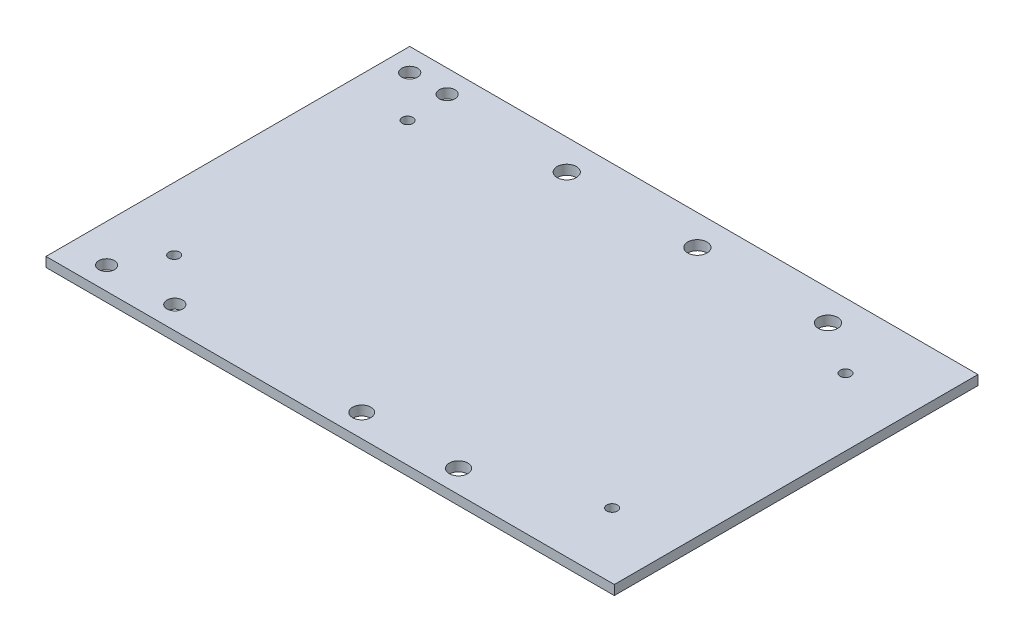
ISO-10303-21;
HEADER;
FILE_DESCRIPTION(('STEP AP214'),'2;1');
FILE_NAME('part.step','',(''),(''),'','','');
FILE_SCHEMA(('AUTOMOTIVE_DESIGN { 1 0 10303 214 1 1 1 1 }'));
ENDSEC;
DATA;
#1=APPLICATION_CONTEXT('core data for automotive mechanical design processes');
#2=APPLICATION_PROTOCOL_DEFINITION('international standard','automotive_design',2000,#1);
#3=PRODUCT_CONTEXT('',#1,'mechanical');
#4=PRODUCT('Part','Part','',(#3));
#5=PRODUCT_RELATED_PRODUCT_CATEGORY('part','',(#4));
#6=PRODUCT_DEFINITION_FORMATION('','',#4);
#7=PRODUCT_DEFINITION_CONTEXT('part definition',#1,'design');
#8=PRODUCT_DEFINITION('design','',#6,#7);
#9=PRODUCT_DEFINITION_SHAPE('','',#8);
#10=(LENGTH_UNIT() NAMED_UNIT(*) SI_UNIT(.MILLI.,.METRE.));
#11=(NAMED_UNIT(*) PLANE_ANGLE_UNIT() SI_UNIT($,.RADIAN.));
#12=(NAMED_UNIT(*) SI_UNIT($,.STERADIAN.) SOLID_ANGLE_UNIT());
#13=UNCERTAINTY_MEASURE_WITH_UNIT(LENGTH_MEASURE(1.E-05),#10,'distance_accuracy_value','');
#14=(GEOMETRIC_REPRESENTATION_CONTEXT(3) GLOBAL_UNCERTAINTY_ASSIGNED_CONTEXT((#13)) GLOBAL_UNIT_ASSIGNED_CONTEXT((#10,
#11,#12)) REPRESENTATION_CONTEXT('',''));
#15=CARTESIAN_POINT('',(0.,0.,0.));
#16=DIRECTION('',(0.,0.,1.));
#17=DIRECTION('',(1.,0.,0.));
#18=AXIS2_PLACEMENT_3D('',#15,#16,#17);
#19=CARTESIAN_POINT('',(0.,-6.35,0.));
#20=DIRECTION('',(-1.,0.,0.));
#21=DIRECTION('',(0.,0.,1.));
#22=AXIS2_PLACEMENT_3D('',#19,#20,#21);
#23=PLANE('',#22);
#24=DIRECTION('',(0.,0.,1.));
#25=VECTOR('',#24,1.);
#26=CARTESIAN_POINT('',(0.,0.,0.));
#27=LINE('',#26,#25);
#28=CARTESIAN_POINT('',(0.,0.,0.));
#29=VERTEX_POINT('',#28);
#30=CARTESIAN_POINT('',(0.,0.,240.));
#31=VERTEX_POINT('',#30);
#32=EDGE_CURVE('E110',#29,#31,#27,.T.);
#33=ORIENTED_EDGE('',*,*,#32,.F.);
#34=DIRECTION('',(0.,1.,0.));
#35=VECTOR('',#34,1.);
#36=CARTESIAN_POINT('',(0.,-6.35,0.));
#37=LINE('',#36,#35);
#38=CARTESIAN_POINT('',(0.,-6.35,0.));
#39=VERTEX_POINT('',#38);
#40=EDGE_CURVE('E11',#39,#29,#37,.T.);
#41=ORIENTED_EDGE('',*,*,#40,.F.);
#42=DIRECTION('',(0.,0.,1.));
#43=VECTOR('',#42,1.);
#44=CARTESIAN_POINT('',(0.,-6.35,0.));
#45=LINE('',#44,#43);
#46=CARTESIAN_POINT('',(0.,-6.35,240.));
#47=VERTEX_POINT('',#46);
#48=EDGE_CURVE('E102',#39,#47,#45,.T.);
#49=ORIENTED_EDGE('',*,*,#48,.T.);
#50=DIRECTION('',(0.,1.,0.));
#51=VECTOR('',#50,1.);
#52=CARTESIAN_POINT('',(0.,-6.35,240.));
#53=LINE('',#52,#51);
#54=EDGE_CURVE('E46',#47,#31,#53,.T.);
#55=ORIENTED_EDGE('',*,*,#54,.T.);
#56=EDGE_LOOP('',(#33,#41,#49,#55));
#57=FACE_BOUND('',#56,.T.);
#58=ADVANCED_FACE('F43',(#57),#23,.T.);
#59=CARTESIAN_POINT('',(0.,-6.35,0.));
#60=DIRECTION('',(0.,0.,-1.));
#61=DIRECTION('',(-1.,0.,0.));
#62=AXIS2_PLACEMENT_3D('',#59,#60,#61);
#63=PLANE('',#62);
#64=DIRECTION('',(-1.,0.,0.));
#65=VECTOR('',#64,1.);
#66=CARTESIAN_POINT('',(0.,0.,0.));
#67=LINE('',#66,#65);
#68=CARTESIAN_POINT('',(375.,0.,0.));
#69=VERTEX_POINT('',#68);
#70=EDGE_CURVE('E104',#69,#29,#67,.T.);
#71=ORIENTED_EDGE('',*,*,#70,.F.);
#72=DIRECTION('',(0.,1.,0.));
#73=VECTOR('',#72,1.);
#74=CARTESIAN_POINT('',(375.,-6.35,0.));
#75=LINE('',#74,#73);
#76=CARTESIAN_POINT('',(375.,-6.35,0.));
#77=VERTEX_POINT('',#76);
#78=EDGE_CURVE('E52',#77,#69,#75,.T.);
#79=ORIENTED_EDGE('',*,*,#78,.F.);
#80=DIRECTION('',(-1.,0.,0.));
#81=VECTOR('',#80,1.);
#82=CARTESIAN_POINT('',(0.,-6.35,0.));
#83=LINE('',#82,#81);
#84=EDGE_CURVE('E99',#77,#39,#83,.T.);
#85=ORIENTED_EDGE('',*,*,#84,.T.);
#86=ORIENTED_EDGE('',*,*,#40,.T.);
#87=EDGE_LOOP('',(#71,#79,#85,#86));
#88=FACE_BOUND('',#87,.T.);
#89=ADVANCED_FACE('F213',(#88),#63,.T.);
#90=CARTESIAN_POINT('',(375.,-6.35,0.));
#91=DIRECTION('',(1.,0.,0.));
#92=DIRECTION('',(0.,0.,-1.));
#93=AXIS2_PLACEMENT_3D('',#90,#91,#92);
#94=PLANE('',#93);
#95=DIRECTION('',(0.,0.,-1.));
#96=VECTOR('',#95,1.);
#97=CARTESIAN_POINT('',(375.,0.,0.));
#98=LINE('',#97,#96);
#99=CARTESIAN_POINT('',(375.,0.,240.));
#100=VERTEX_POINT('',#99);
#101=EDGE_CURVE('E94',#100,#69,#98,.T.);
#102=ORIENTED_EDGE('',*,*,#101,.F.);
#103=DIRECTION('',(0.,1.,0.));
#104=VECTOR('',#103,1.);
#105=CARTESIAN_POINT('',(375.,-6.35,240.));
#106=LINE('',#105,#104);
#107=CARTESIAN_POINT('',(375.,-6.35,240.));
#108=VERTEX_POINT('',#107);
#109=EDGE_CURVE('E89',#108,#100,#106,.T.);
#110=ORIENTED_EDGE('',*,*,#109,.F.);
#111=DIRECTION('',(0.,0.,-1.));
#112=VECTOR('',#111,1.);
#113=CARTESIAN_POINT('',(375.,-6.35,0.));
#114=LINE('',#113,#112);
#115=EDGE_CURVE('E92',#108,#77,#114,.T.);
#116=ORIENTED_EDGE('',*,*,#115,.T.);
#117=ORIENTED_EDGE('',*,*,#78,.T.);
#118=EDGE_LOOP('',(#102,#110,#116,#117));
#119=FACE_BOUND('',#118,.T.);
#120=ADVANCED_FACE('F91',(#119),#94,.T.);
#121=CARTESIAN_POINT('',(0.,-6.35,240.));
#122=DIRECTION('',(0.,0.,1.));
#123=DIRECTION('',(1.,0.,0.));
#124=AXIS2_PLACEMENT_3D('',#121,#122,#123);
#125=PLANE('',#124);
#126=DIRECTION('',(1.,0.,0.));
#127=VECTOR('',#126,1.);
#128=CARTESIAN_POINT('',(0.,0.,240.));
#129=LINE('',#128,#127);
#130=EDGE_CURVE('E113',#31,#100,#129,.T.);
#131=ORIENTED_EDGE('',*,*,#130,.F.);
#132=ORIENTED_EDGE('',*,*,#54,.F.);
#133=DIRECTION('',(1.,0.,0.));
#134=VECTOR('',#133,1.);
#135=CARTESIAN_POINT('',(0.,-6.35,240.));
#136=LINE('',#135,#134);
#137=EDGE_CURVE('E98',#47,#108,#136,.T.);
#138=ORIENTED_EDGE('',*,*,#137,.T.);
#139=ORIENTED_EDGE('',*,*,#109,.T.);
#140=EDGE_LOOP('',(#131,#132,#138,#139));
#141=FACE_BOUND('',#140,.T.);
#142=ADVANCED_FACE('F101',(#141),#125,.T.);
#143=CARTESIAN_POINT('',(0.,-6.35,0.));
#144=DIRECTION('',(0.,1.,0.));
#145=DIRECTION('',(0.,0.,1.));
#146=AXIS2_PLACEMENT_3D('',#143,#144,#145);
#147=PLANE('',#146);
#148=CARTESIAN_POINT('',(296.017915754674,-6.35,19.9999999999997));
#149=DIRECTION('',(0.,1.,0.));
#150=DIRECTION('',(0.,0.,1.));
#151=AXIS2_PLACEMENT_3D('',#148,#149,#150);
#152=CIRCLE('',#151,6.34999999999994);
#153=CARTESIAN_POINT('',(296.017915754674,-6.35,26.3499999999996));
#154=VERTEX_POINT('',#153);
#155=EDGE_CURVE('E133',#154,#154,#152,.T.);
#156=ORIENTED_EDGE('',*,*,#155,.T.);
#157=EDGE_LOOP('',(#156));
#158=FACE_BOUND('',#157,.T.);
#159=CARTESIAN_POINT('',(123.622084245326,-6.35,20.0000000000003));
#160=DIRECTION('',(0.,1.,0.));
#161=DIRECTION('',(0.,0.,1.));
#162=AXIS2_PLACEMENT_3D('',#159,#160,#161);
#163=CIRCLE('',#162,6.35);
#164=CARTESIAN_POINT('',(123.622084245326,-6.35,26.3500000000003));
#165=VERTEX_POINT('',#164);
#166=EDGE_CURVE('E144',#165,#165,#163,.T.);
#167=ORIENTED_EDGE('',*,*,#166,.T.);
#168=EDGE_LOOP('',(#167));
#169=FACE_BOUND('',#168,.T.);
#170=CARTESIAN_POINT('',(209.82,-6.35,20.));
#171=DIRECTION('',(0.,1.,0.));
#172=DIRECTION('',(0.,0.,1.));
#173=AXIS2_PLACEMENT_3D('',#170,#171,#172);
#174=CIRCLE('',#173,6.34999999999994);
#175=CARTESIAN_POINT('',(209.82,-6.35,26.3499999999999));
#176=VERTEX_POINT('',#175);
#177=EDGE_CURVE('E130',#176,#176,#174,.T.);
#178=ORIENTED_EDGE('',*,*,#177,.T.);
#179=EDGE_LOOP('',(#178));
#180=FACE_BOUND('',#179,.T.);
#181=CARTESIAN_POINT('',(330.566569971723,-6.35,42.9999999999998));
#182=DIRECTION('',(0.,1.,0.));
#183=DIRECTION('',(0.,0.,1.));
#184=AXIS2_PLACEMENT_3D('',#181,#182,#183);
#185=CIRCLE('',#184,3.50000000000002);
#186=CARTESIAN_POINT('',(330.566569971723,-6.35,46.4999999999998));
#187=VERTEX_POINT('',#186);
#188=EDGE_CURVE('E123',#187,#187,#185,.T.);
#189=ORIENTED_EDGE('',*,*,#188,.T.);
#190=EDGE_LOOP('',(#189));
#191=FACE_BOUND('',#190,.T.);
#192=CARTESIAN_POINT('',(41.5665699717228,-6.35,42.9999999999998));
#193=DIRECTION('',(0.,1.,0.));
#194=DIRECTION('',(0.,0.,1.));
#195=AXIS2_PLACEMENT_3D('',#192,#193,#194);
#196=CIRCLE('',#195,3.5);
#197=CARTESIAN_POINT('',(41.5665699717228,-6.35,46.4999999999998));
#198=VERTEX_POINT('',#197);
#199=EDGE_CURVE('E154',#198,#198,#196,.T.);
#200=ORIENTED_EDGE('',*,*,#199,.T.);
#201=EDGE_LOOP('',(#200));
#202=FACE_BOUND('',#201,.T.);
#203=CARTESIAN_POINT('',(330.566569971723,-6.35,197.));
#204=DIRECTION('',(0.,1.,0.));
#205=DIRECTION('',(0.,0.,1.));
#206=AXIS2_PLACEMENT_3D('',#203,#204,#205);
#207=CIRCLE('',#206,3.50000000000002);
#208=CARTESIAN_POINT('',(330.566569971723,-6.35,200.5));
#209=VERTEX_POINT('',#208);
#210=EDGE_CURVE('E160',#209,#209,#207,.T.);
#211=ORIENTED_EDGE('',*,*,#210,.T.);
#212=EDGE_LOOP('',(#211));
#213=FACE_BOUND('',#212,.T.);
#214=CARTESIAN_POINT('',(41.5665699717228,-6.35,197.));
#215=DIRECTION('',(0.,1.,0.));
#216=DIRECTION('',(0.,0.,1.));
#217=AXIS2_PLACEMENT_3D('',#214,#215,#216);
#218=CIRCLE('',#217,3.5);
#219=CARTESIAN_POINT('',(41.5665699717228,-6.35,200.5));
#220=VERTEX_POINT('',#219);
#221=EDGE_CURVE('E166',#220,#220,#218,.T.);
#222=ORIENTED_EDGE('',*,*,#221,.T.);
#223=EDGE_LOOP('',(#222));
#224=FACE_BOUND('',#223,.T.);
#225=CARTESIAN_POINT('',(193.34,-6.35,225.));
#226=DIRECTION('',(0.,1.,0.));
#227=DIRECTION('',(0.,0.,1.));
#228=AXIS2_PLACEMENT_3D('',#225,#226,#227);
#229=CIRCLE('',#228,6.01824754594228);
#230=CARTESIAN_POINT('',(193.34,-6.35,231.018247545942));
#231=VERTEX_POINT('',#230);
#232=EDGE_CURVE('E172',#231,#231,#229,.T.);
#233=ORIENTED_EDGE('',*,*,#232,.T.);
#234=EDGE_LOOP('',(#233));
#235=FACE_BOUND('',#234,.T.);
#236=CARTESIAN_POINT('',(257.244291661755,-6.35,225.));
#237=DIRECTION('',(0.,1.,0.));
#238=DIRECTION('',(0.,0.,1.));
#239=AXIS2_PLACEMENT_3D('',#236,#237,#238);
#240=CIRCLE('',#239,6.10695320472578);
#241=CARTESIAN_POINT('',(257.244291661755,-6.35,231.106953204726));
#242=VERTEX_POINT('',#241);
#243=EDGE_CURVE('E178',#242,#242,#240,.T.);
#244=ORIENTED_EDGE('',*,*,#243,.T.);
#245=EDGE_LOOP('',(#244));
#246=FACE_BOUND('',#245,.T.);
#247=CARTESIAN_POINT('',(15.,-6.35,15.));
#248=DIRECTION('',(0.,1.,0.));
#249=DIRECTION('',(0.,0.,1.));
#250=AXIS2_PLACEMENT_3D('',#247,#248,#249);
#251=CIRCLE('',#250,5.18149012151752);
#252=CARTESIAN_POINT('',(15.,-6.35,20.1814901215175));
#253=VERTEX_POINT('',#252);
#254=EDGE_CURVE('E184',#253,#253,#251,.T.);
#255=ORIENTED_EDGE('',*,*,#254,.T.);
#256=EDGE_LOOP('',(#255));
#257=FACE_BOUND('',#256,.T.);
#258=CARTESIAN_POINT('',(70.,-6.35,225.));
#259=DIRECTION('',(0.,1.,0.));
#260=DIRECTION('',(0.,0.,1.));
#261=AXIS2_PLACEMENT_3D('',#258,#259,#260);
#262=CIRCLE('',#261,5.18149012151752);
#263=CARTESIAN_POINT('',(70.,-6.35,230.181490121517));
#264=VERTEX_POINT('',#263);
#265=EDGE_CURVE('E190',#264,#264,#262,.T.);
#266=ORIENTED_EDGE('',*,*,#265,.T.);
#267=EDGE_LOOP('',(#266));
#268=FACE_BOUND('',#267,.T.);
#269=CARTESIAN_POINT('',(25.,-6.35,225.));
#270=DIRECTION('',(0.,1.,0.));
#271=DIRECTION('',(0.,0.,1.));
#272=AXIS2_PLACEMENT_3D('',#269,#270,#271);
#273=CIRCLE('',#272,5.18149012151751);
#274=CARTESIAN_POINT('',(25.,-6.35,230.181490121517));
#275=VERTEX_POINT('',#274);
#276=EDGE_CURVE('E196',#275,#275,#273,.T.);
#277=ORIENTED_EDGE('',*,*,#276,.T.);
#278=EDGE_LOOP('',(#277));
#279=FACE_BOUND('',#278,.T.);
#280=CARTESIAN_POINT('',(39.6803799505979,-6.35,15.));
#281=DIRECTION('',(0.,1.,0.));
#282=DIRECTION('',(0.,0.,1.));
#283=AXIS2_PLACEMENT_3D('',#280,#281,#282);
#284=CIRCLE('',#283,5.18149012151752);
#285=CARTESIAN_POINT('',(39.6803799505979,-6.35,20.1814901215175));
#286=VERTEX_POINT('',#285);
#287=EDGE_CURVE('E114',#286,#286,#284,.T.);
#288=ORIENTED_EDGE('',*,*,#287,.T.);
#289=EDGE_LOOP('',(#288));
#290=FACE_BOUND('',#289,.T.);
#291=ORIENTED_EDGE('',*,*,#48,.F.);
#292=ORIENTED_EDGE('',*,*,#84,.F.);
#293=ORIENTED_EDGE('',*,*,#115,.F.);
#294=ORIENTED_EDGE('',*,*,#137,.F.);
#295=EDGE_LOOP('',(#291,#292,#293,#294));
#296=FACE_BOUND('',#295,.T.);
#297=ADVANCED_FACE('F97',(#158,#169,#180,#191,#202,#213,#224,#235,#246,#257,#268,#279,#290,
#296),#147,.F.);
#298=CARTESIAN_POINT('',(0.,0.,0.));
#299=DIRECTION('',(0.,1.,0.));
#300=DIRECTION('',(0.,0.,1.));
#301=AXIS2_PLACEMENT_3D('',#298,#299,#300);
#302=PLANE('',#301);
#303=CARTESIAN_POINT('',(296.017915754674,0.,19.9999999999997));
#304=DIRECTION('',(0.,1.,0.));
#305=DIRECTION('',(0.,0.,1.));
#306=AXIS2_PLACEMENT_3D('',#303,#304,#305);
#307=CIRCLE('',#306,6.34999999999994);
#308=CARTESIAN_POINT('',(296.017915754674,0.,26.3499999999996));
#309=VERTEX_POINT('',#308);
#310=EDGE_CURVE('E136',#309,#309,#307,.T.);
#311=ORIENTED_EDGE('',*,*,#310,.F.);
#312=EDGE_LOOP('',(#311));
#313=FACE_BOUND('',#312,.T.);
#314=CARTESIAN_POINT('',(123.622084245326,0.,20.0000000000003));
#315=DIRECTION('',(0.,1.,0.));
#316=DIRECTION('',(0.,0.,1.));
#317=AXIS2_PLACEMENT_3D('',#314,#315,#316);
#318=CIRCLE('',#317,6.35);
#319=CARTESIAN_POINT('',(123.622084245326,0.,26.3500000000003));
#320=VERTEX_POINT('',#319);
#321=EDGE_CURVE('E135',#320,#320,#318,.T.);
#322=ORIENTED_EDGE('',*,*,#321,.F.);
#323=EDGE_LOOP('',(#322));
#324=FACE_BOUND('',#323,.T.);
#325=CARTESIAN_POINT('',(209.82,0.,20.));
#326=DIRECTION('',(0.,1.,0.));
#327=DIRECTION('',(0.,0.,1.));
#328=AXIS2_PLACEMENT_3D('',#325,#326,#327);
#329=CIRCLE('',#328,6.34999999999994);
#330=CARTESIAN_POINT('',(209.82,0.,26.3499999999999));
#331=VERTEX_POINT('',#330);
#332=EDGE_CURVE('E147',#331,#331,#329,.T.);
#333=ORIENTED_EDGE('',*,*,#332,.F.);
#334=EDGE_LOOP('',(#333));
#335=FACE_BOUND('',#334,.T.);
#336=CARTESIAN_POINT('',(330.566569971723,0.,42.9999999999998));
#337=DIRECTION('',(0.,1.,0.));
#338=DIRECTION('',(0.,0.,1.));
#339=AXIS2_PLACEMENT_3D('',#336,#337,#338);
#340=CIRCLE('',#339,3.50000000000002);
#341=CARTESIAN_POINT('',(330.566569971723,0.,46.4999999999998));
#342=VERTEX_POINT('',#341);
#343=EDGE_CURVE('E127',#342,#342,#340,.T.);
#344=ORIENTED_EDGE('',*,*,#343,.F.);
#345=EDGE_LOOP('',(#344));
#346=FACE_BOUND('',#345,.T.);
#347=CARTESIAN_POINT('',(41.5665699717228,0.,42.9999999999998));
#348=DIRECTION('',(0.,1.,0.));
#349=DIRECTION('',(0.,0.,1.));
#350=AXIS2_PLACEMENT_3D('',#347,#348,#349);
#351=CIRCLE('',#350,3.5);
#352=CARTESIAN_POINT('',(41.5665699717228,0.,46.4999999999998));
#353=VERTEX_POINT('',#352);
#354=EDGE_CURVE('E126',#353,#353,#351,.T.);
#355=ORIENTED_EDGE('',*,*,#354,.F.);
#356=EDGE_LOOP('',(#355));
#357=FACE_BOUND('',#356,.T.);
#358=CARTESIAN_POINT('',(330.566569971723,0.,197.));
#359=DIRECTION('',(0.,1.,0.));
#360=DIRECTION('',(0.,0.,1.));
#361=AXIS2_PLACEMENT_3D('',#358,#359,#360);
#362=CIRCLE('',#361,3.50000000000002);
#363=CARTESIAN_POINT('',(330.566569971723,0.,200.5));
#364=VERTEX_POINT('',#363);
#365=EDGE_CURVE('E157',#364,#364,#362,.T.);
#366=ORIENTED_EDGE('',*,*,#365,.F.);
#367=EDGE_LOOP('',(#366));
#368=FACE_BOUND('',#367,.T.);
#369=CARTESIAN_POINT('',(41.5665699717228,0.,197.));
#370=DIRECTION('',(0.,1.,0.));
#371=DIRECTION('',(0.,0.,1.));
#372=AXIS2_PLACEMENT_3D('',#369,#370,#371);
#373=CIRCLE('',#372,3.5);
#374=CARTESIAN_POINT('',(41.5665699717228,0.,200.5));
#375=VERTEX_POINT('',#374);
#376=EDGE_CURVE('E163',#375,#375,#373,.T.);
#377=ORIENTED_EDGE('',*,*,#376,.F.);
#378=EDGE_LOOP('',(#377));
#379=FACE_BOUND('',#378,.T.);
#380=CARTESIAN_POINT('',(193.34,0.,225.));
#381=DIRECTION('',(0.,1.,0.));
#382=DIRECTION('',(0.,0.,1.));
#383=AXIS2_PLACEMENT_3D('',#380,#381,#382);
#384=CIRCLE('',#383,6.01824754594228);
#385=CARTESIAN_POINT('',(193.34,0.,231.018247545942));
#386=VERTEX_POINT('',#385);
#387=EDGE_CURVE('E169',#386,#386,#384,.T.);
#388=ORIENTED_EDGE('',*,*,#387,.F.);
#389=EDGE_LOOP('',(#388));
#390=FACE_BOUND('',#389,.T.);
#391=CARTESIAN_POINT('',(257.244291661755,0.,225.));
#392=DIRECTION('',(0.,1.,0.));
#393=DIRECTION('',(0.,0.,1.));
#394=AXIS2_PLACEMENT_3D('',#391,#392,#393);
#395=CIRCLE('',#394,6.10695320472578);
#396=CARTESIAN_POINT('',(257.244291661755,0.,231.106953204726));
#397=VERTEX_POINT('',#396);
#398=EDGE_CURVE('E175',#397,#397,#395,.T.);
#399=ORIENTED_EDGE('',*,*,#398,.F.);
#400=EDGE_LOOP('',(#399));
#401=FACE_BOUND('',#400,.T.);
#402=CARTESIAN_POINT('',(15.,0.,15.));
#403=DIRECTION('',(0.,1.,0.));
#404=DIRECTION('',(0.,0.,1.));
#405=AXIS2_PLACEMENT_3D('',#402,#403,#404);
#406=CIRCLE('',#405,5.18149012151752);
#407=CARTESIAN_POINT('',(15.,0.,20.1814901215175));
#408=VERTEX_POINT('',#407);
#409=EDGE_CURVE('E181',#408,#408,#406,.T.);
#410=ORIENTED_EDGE('',*,*,#409,.F.);
#411=EDGE_LOOP('',(#410));
#412=FACE_BOUND('',#411,.T.);
#413=CARTESIAN_POINT('',(70.,0.,225.));
#414=DIRECTION('',(0.,1.,0.));
#415=DIRECTION('',(0.,0.,1.));
#416=AXIS2_PLACEMENT_3D('',#413,#414,#415);
#417=CIRCLE('',#416,5.18149012151752);
#418=CARTESIAN_POINT('',(70.,0.,230.181490121517));
#419=VERTEX_POINT('',#418);
#420=EDGE_CURVE('E187',#419,#419,#417,.T.);
#421=ORIENTED_EDGE('',*,*,#420,.F.);
#422=EDGE_LOOP('',(#421));
#423=FACE_BOUND('',#422,.T.);
#424=CARTESIAN_POINT('',(25.,0.,225.));
#425=DIRECTION('',(0.,1.,0.));
#426=DIRECTION('',(0.,0.,1.));
#427=AXIS2_PLACEMENT_3D('',#424,#425,#426);
#428=CIRCLE('',#427,5.18149012151751);
#429=CARTESIAN_POINT('',(25.,0.,230.181490121517));
#430=VERTEX_POINT('',#429);
#431=EDGE_CURVE('E193',#430,#430,#428,.T.);
#432=ORIENTED_EDGE('',*,*,#431,.F.);
#433=EDGE_LOOP('',(#432));
#434=FACE_BOUND('',#433,.T.);
#435=CARTESIAN_POINT('',(39.6803799505979,0.,15.));
#436=DIRECTION('',(0.,1.,0.));
#437=DIRECTION('',(0.,0.,1.));
#438=AXIS2_PLACEMENT_3D('',#435,#436,#437);
#439=CIRCLE('',#438,5.18149012151752);
#440=CARTESIAN_POINT('',(39.6803799505979,0.,20.1814901215175));
#441=VERTEX_POINT('',#440);
#442=EDGE_CURVE('E199',#441,#441,#439,.T.);
#443=ORIENTED_EDGE('',*,*,#442,.F.);
#444=EDGE_LOOP('',(#443));
#445=FACE_BOUND('',#444,.T.);
#446=ORIENTED_EDGE('',*,*,#32,.T.);
#447=ORIENTED_EDGE('',*,*,#130,.T.);
#448=ORIENTED_EDGE('',*,*,#101,.T.);
#449=ORIENTED_EDGE('',*,*,#70,.T.);
#450=EDGE_LOOP('',(#446,#447,#448,#449));
#451=FACE_BOUND('',#450,.T.);
#452=ADVANCED_FACE('F208',(#313,#324,#335,#346,#357,#368,#379,#390,#401,#412,#423,#434,#445,
#451),#302,.T.);
#453=CARTESIAN_POINT('',(39.6803799505979,-6.35,15.));
#454=DIRECTION('',(0.,1.,0.));
#455=DIRECTION('',(0.,0.,1.));
#456=AXIS2_PLACEMENT_3D('',#453,#454,#455);
#457=CYLINDRICAL_SURFACE('',#456,5.18149012151752);
#458=ORIENTED_EDGE('',*,*,#287,.F.);
#459=EDGE_LOOP('',(#458));
#460=FACE_BOUND('',#459,.T.);
#461=ORIENTED_EDGE('',*,*,#442,.T.);
#462=EDGE_LOOP('',(#461));
#463=FACE_BOUND('',#462,.T.);
#464=ADVANCED_FACE('F206',(#460,#463),#457,.F.);
#465=CARTESIAN_POINT('',(25.,-6.35,225.));
#466=DIRECTION('',(0.,1.,0.));
#467=DIRECTION('',(0.,0.,1.));
#468=AXIS2_PLACEMENT_3D('',#465,#466,#467);
#469=CYLINDRICAL_SURFACE('',#468,5.18149012151751);
#470=ORIENTED_EDGE('',*,*,#276,.F.);
#471=EDGE_LOOP('',(#470));
#472=FACE_BOUND('',#471,.T.);
#473=ORIENTED_EDGE('',*,*,#431,.T.);
#474=EDGE_LOOP('',(#473));
#475=FACE_BOUND('',#474,.T.);
#476=ADVANCED_FACE('F233',(#472,#475),#469,.F.);
#477=CARTESIAN_POINT('',(70.,-6.35,225.));
#478=DIRECTION('',(0.,1.,0.));
#479=DIRECTION('',(0.,0.,1.));
#480=AXIS2_PLACEMENT_3D('',#477,#478,#479);
#481=CYLINDRICAL_SURFACE('',#480,5.18149012151752);
#482=ORIENTED_EDGE('',*,*,#265,.F.);
#483=EDGE_LOOP('',(#482));
#484=FACE_BOUND('',#483,.T.);
#485=ORIENTED_EDGE('',*,*,#420,.T.);
#486=EDGE_LOOP('',(#485));
#487=FACE_BOUND('',#486,.T.);
#488=ADVANCED_FACE('F237',(#484,#487),#481,.F.);
#489=CARTESIAN_POINT('',(15.,-6.35,15.));
#490=DIRECTION('',(0.,1.,0.));
#491=DIRECTION('',(0.,0.,1.));
#492=AXIS2_PLACEMENT_3D('',#489,#490,#491);
#493=CYLINDRICAL_SURFACE('',#492,5.18149012151752);
#494=ORIENTED_EDGE('',*,*,#254,.F.);
#495=EDGE_LOOP('',(#494));
#496=FACE_BOUND('',#495,.T.);
#497=ORIENTED_EDGE('',*,*,#409,.T.);
#498=EDGE_LOOP('',(#497));
#499=FACE_BOUND('',#498,.T.);
#500=ADVANCED_FACE('F241',(#496,#499),#493,.F.);
#501=CARTESIAN_POINT('',(257.244291661755,-6.35,225.));
#502=DIRECTION('',(0.,1.,0.));
#503=DIRECTION('',(0.,0.,1.));
#504=AXIS2_PLACEMENT_3D('',#501,#502,#503);
#505=CYLINDRICAL_SURFACE('',#504,6.10695320472578);
#506=ORIENTED_EDGE('',*,*,#243,.F.);
#507=EDGE_LOOP('',(#506));
#508=FACE_BOUND('',#507,.T.);
#509=ORIENTED_EDGE('',*,*,#398,.T.);
#510=EDGE_LOOP('',(#509));
#511=FACE_BOUND('',#510,.T.);
#512=ADVANCED_FACE('F245',(#508,#511),#505,.F.);
#513=CARTESIAN_POINT('',(193.34,-6.35,225.));
#514=DIRECTION('',(0.,1.,0.));
#515=DIRECTION('',(0.,0.,1.));
#516=AXIS2_PLACEMENT_3D('',#513,#514,#515);
#517=CYLINDRICAL_SURFACE('',#516,6.01824754594228);
#518=ORIENTED_EDGE('',*,*,#232,.F.);
#519=EDGE_LOOP('',(#518));
#520=FACE_BOUND('',#519,.T.);
#521=ORIENTED_EDGE('',*,*,#387,.T.);
#522=EDGE_LOOP('',(#521));
#523=FACE_BOUND('',#522,.T.);
#524=ADVANCED_FACE('F249',(#520,#523),#517,.F.);
#525=CARTESIAN_POINT('',(41.5665699717228,-6.35,197.));
#526=DIRECTION('',(0.,1.,0.));
#527=DIRECTION('',(0.,0.,1.));
#528=AXIS2_PLACEMENT_3D('',#525,#526,#527);
#529=CYLINDRICAL_SURFACE('',#528,3.5);
#530=ORIENTED_EDGE('',*,*,#221,.F.);
#531=EDGE_LOOP('',(#530));
#532=FACE_BOUND('',#531,.T.);
#533=ORIENTED_EDGE('',*,*,#376,.T.);
#534=EDGE_LOOP('',(#533));
#535=FACE_BOUND('',#534,.T.);
#536=ADVANCED_FACE('F253',(#532,#535),#529,.F.);
#537=CARTESIAN_POINT('',(330.566569971723,-6.35,197.));
#538=DIRECTION('',(0.,1.,0.));
#539=DIRECTION('',(0.,0.,1.));
#540=AXIS2_PLACEMENT_3D('',#537,#538,#539);
#541=CYLINDRICAL_SURFACE('',#540,3.50000000000002);
#542=ORIENTED_EDGE('',*,*,#210,.F.);
#543=EDGE_LOOP('',(#542));
#544=FACE_BOUND('',#543,.T.);
#545=ORIENTED_EDGE('',*,*,#365,.T.);
#546=EDGE_LOOP('',(#545));
#547=FACE_BOUND('',#546,.T.);
#548=ADVANCED_FACE('F257',(#544,#547),#541,.F.);
#549=CARTESIAN_POINT('',(41.5665699717228,-6.35,42.9999999999998));
#550=DIRECTION('',(0.,1.,0.));
#551=DIRECTION('',(0.,0.,1.));
#552=AXIS2_PLACEMENT_3D('',#549,#550,#551);
#553=CYLINDRICAL_SURFACE('',#552,3.5);
#554=ORIENTED_EDGE('',*,*,#199,.F.);
#555=EDGE_LOOP('',(#554));
#556=FACE_BOUND('',#555,.T.);
#557=ORIENTED_EDGE('',*,*,#354,.T.);
#558=EDGE_LOOP('',(#557));
#559=FACE_BOUND('',#558,.T.);
#560=ADVANCED_FACE('F261',(#556,#559),#553,.F.);
#561=CARTESIAN_POINT('',(330.566569971723,-6.35,42.9999999999998));
#562=DIRECTION('',(0.,1.,0.));
#563=DIRECTION('',(0.,0.,1.));
#564=AXIS2_PLACEMENT_3D('',#561,#562,#563);
#565=CYLINDRICAL_SURFACE('',#564,3.50000000000002);
#566=ORIENTED_EDGE('',*,*,#188,.F.);
#567=EDGE_LOOP('',(#566));
#568=FACE_BOUND('',#567,.T.);
#569=ORIENTED_EDGE('',*,*,#343,.T.);
#570=EDGE_LOOP('',(#569));
#571=FACE_BOUND('',#570,.T.);
#572=ADVANCED_FACE('F265',(#568,#571),#565,.F.);
#573=CARTESIAN_POINT('',(209.82,-6.35,20.));
#574=DIRECTION('',(0.,1.,0.));
#575=DIRECTION('',(0.,0.,1.));
#576=AXIS2_PLACEMENT_3D('',#573,#574,#575);
#577=CYLINDRICAL_SURFACE('',#576,6.34999999999994);
#578=ORIENTED_EDGE('',*,*,#177,.F.);
#579=EDGE_LOOP('',(#578));
#580=FACE_BOUND('',#579,.T.);
#581=ORIENTED_EDGE('',*,*,#332,.T.);
#582=EDGE_LOOP('',(#581));
#583=FACE_BOUND('',#582,.T.);
#584=ADVANCED_FACE('F269',(#580,#583),#577,.F.);
#585=CARTESIAN_POINT('',(123.622084245326,-6.35,20.0000000000003));
#586=DIRECTION('',(0.,1.,0.));
#587=DIRECTION('',(0.,0.,1.));
#588=AXIS2_PLACEMENT_3D('',#585,#586,#587);
#589=CYLINDRICAL_SURFACE('',#588,6.35);
#590=ORIENTED_EDGE('',*,*,#166,.F.);
#591=EDGE_LOOP('',(#590));
#592=FACE_BOUND('',#591,.T.);
#593=ORIENTED_EDGE('',*,*,#321,.T.);
#594=EDGE_LOOP('',(#593));
#595=FACE_BOUND('',#594,.T.);
#596=ADVANCED_FACE('F273',(#592,#595),#589,.F.);
#597=CARTESIAN_POINT('',(296.017915754674,-6.35,19.9999999999997));
#598=DIRECTION('',(0.,1.,0.));
#599=DIRECTION('',(0.,0.,1.));
#600=AXIS2_PLACEMENT_3D('',#597,#598,#599);
#601=CYLINDRICAL_SURFACE('',#600,6.34999999999994);
#602=ORIENTED_EDGE('',*,*,#155,.F.);
#603=EDGE_LOOP('',(#602));
#604=FACE_BOUND('',#603,.T.);
#605=ORIENTED_EDGE('',*,*,#310,.T.);
#606=EDGE_LOOP('',(#605));
#607=FACE_BOUND('',#606,.T.);
#608=ADVANCED_FACE('F277',(#604,#607),#601,.F.);
#609=CLOSED_SHELL('',(#58,#89,#120,#142,#297,#452,#464,#476,#488,#500,#512,#524,#536,#548,#560,
#572,#584,#596,#608));
#610=MANIFOLD_SOLID_BREP('B2',#609);
#611=ADVANCED_BREP_SHAPE_REPRESENTATION('',(#18,#610),#14);
#612=SHAPE_DEFINITION_REPRESENTATION(#9,#611);
ENDSEC;
END-ISO-10303-21;
